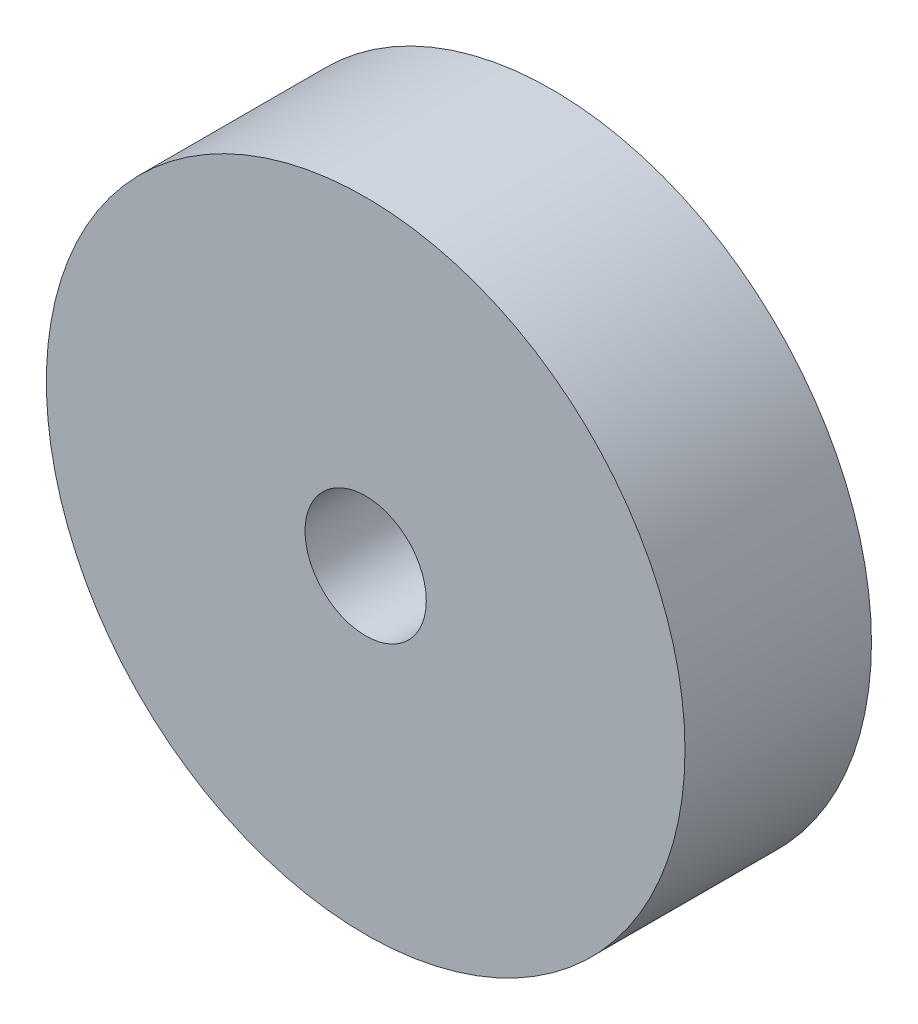
ISO-10303-21;
HEADER;
FILE_DESCRIPTION(('STEP AP214'),'2;1');
FILE_NAME('part.step','',(''),(''),'','','');
FILE_SCHEMA(('AUTOMOTIVE_DESIGN { 1 0 10303 214 1 1 1 1 }'));
ENDSEC;
DATA;
#1=APPLICATION_CONTEXT('core data for automotive mechanical design processes');
#2=APPLICATION_PROTOCOL_DEFINITION('international standard','automotive_design',2000,#1);
#3=PRODUCT_CONTEXT('',#1,'mechanical');
#4=PRODUCT('Part','Part','',(#3));
#5=PRODUCT_RELATED_PRODUCT_CATEGORY('part','',(#4));
#6=PRODUCT_DEFINITION_FORMATION('','',#4);
#7=PRODUCT_DEFINITION_CONTEXT('part definition',#1,'design');
#8=PRODUCT_DEFINITION('design','',#6,#7);
#9=PRODUCT_DEFINITION_SHAPE('','',#8);
#10=(LENGTH_UNIT() NAMED_UNIT(*) SI_UNIT(.MILLI.,.METRE.));
#11=(NAMED_UNIT(*) PLANE_ANGLE_UNIT() SI_UNIT($,.RADIAN.));
#12=(NAMED_UNIT(*) SI_UNIT($,.STERADIAN.) SOLID_ANGLE_UNIT());
#13=UNCERTAINTY_MEASURE_WITH_UNIT(LENGTH_MEASURE(1.E-05),#10,'distance_accuracy_value','');
#14=(GEOMETRIC_REPRESENTATION_CONTEXT(3) GLOBAL_UNCERTAINTY_ASSIGNED_CONTEXT((#13)) GLOBAL_UNIT_ASSIGNED_CONTEXT((#10,
#11,#12)) REPRESENTATION_CONTEXT('',''));
#15=CARTESIAN_POINT('',(0.,0.,0.));
#16=DIRECTION('',(0.,0.,1.));
#17=DIRECTION('',(1.,0.,0.));
#18=AXIS2_PLACEMENT_3D('',#15,#16,#17);
#19=CARTESIAN_POINT('',(0.,0.,40.));
#20=DIRECTION('',(0.,0.,1.));
#21=DIRECTION('',(1.,0.,0.));
#22=AXIS2_PLACEMENT_3D('',#19,#20,#21);
#23=PLANE('',#22);
#24=CARTESIAN_POINT('',(0.,0.,40.));
#25=DIRECTION('',(0.,0.,1.));
#26=DIRECTION('',(1.,0.,0.));
#27=AXIS2_PLACEMENT_3D('',#24,#25,#26);
#28=CIRCLE('',#27,68.5);
#29=CARTESIAN_POINT('',(68.5,0.,40.));
#30=VERTEX_POINT('',#29);
#31=EDGE_CURVE('E10',#30,#30,#28,.T.);
#32=ORIENTED_EDGE('',*,*,#31,.T.);
#33=EDGE_LOOP('',(#32));
#34=FACE_BOUND('',#33,.T.);
#35=CARTESIAN_POINT('',(0.,0.,40.));
#36=DIRECTION('',(0.,0.,1.));
#37=DIRECTION('',(1.,0.,0.));
#38=AXIS2_PLACEMENT_3D('',#35,#36,#37);
#39=CIRCLE('',#38,13.);
#40=CARTESIAN_POINT('',(13.,0.,40.));
#41=VERTEX_POINT('',#40);
#42=EDGE_CURVE('E42',#41,#41,#39,.T.);
#43=ORIENTED_EDGE('',*,*,#42,.F.);
#44=EDGE_LOOP('',(#43));
#45=FACE_BOUND('',#44,.T.);
#46=ADVANCED_FACE('F31',(#34,#45),#23,.T.);
#47=CARTESIAN_POINT('',(0.,0.,0.));
#48=DIRECTION('',(0.,0.,1.));
#49=DIRECTION('',(1.,0.,0.));
#50=AXIS2_PLACEMENT_3D('',#47,#48,#49);
#51=PLANE('',#50);
#52=CARTESIAN_POINT('',(0.,0.,0.));
#53=DIRECTION('',(0.,0.,1.));
#54=DIRECTION('',(1.,0.,0.));
#55=AXIS2_PLACEMENT_3D('',#52,#53,#54);
#56=CIRCLE('',#55,68.5);
#57=CARTESIAN_POINT('',(68.5,0.,0.));
#58=VERTEX_POINT('',#57);
#59=EDGE_CURVE('E35',#58,#58,#56,.T.);
#60=ORIENTED_EDGE('',*,*,#59,.F.);
#61=EDGE_LOOP('',(#60));
#62=FACE_BOUND('',#61,.T.);
#63=CARTESIAN_POINT('',(0.,0.,0.));
#64=DIRECTION('',(0.,0.,1.));
#65=DIRECTION('',(1.,0.,0.));
#66=AXIS2_PLACEMENT_3D('',#63,#64,#65);
#67=CIRCLE('',#66,13.);
#68=CARTESIAN_POINT('',(13.,0.,0.));
#69=VERTEX_POINT('',#68);
#70=EDGE_CURVE('E44',#69,#69,#67,.T.);
#71=ORIENTED_EDGE('',*,*,#70,.T.);
#72=EDGE_LOOP('',(#71));
#73=FACE_BOUND('',#72,.T.);
#74=ADVANCED_FACE('F54',(#62,#73),#51,.F.);
#75=CARTESIAN_POINT('',(0.,0.,40.));
#76=DIRECTION('',(0.,0.,-1.));
#77=DIRECTION('',(-1.,0.,0.));
#78=AXIS2_PLACEMENT_3D('',#75,#76,#77);
#79=CYLINDRICAL_SURFACE('',#78,68.5);
#80=ORIENTED_EDGE('',*,*,#31,.F.);
#81=EDGE_LOOP('',(#80));
#82=FACE_BOUND('',#81,.T.);
#83=ORIENTED_EDGE('',*,*,#59,.T.);
#84=EDGE_LOOP('',(#83));
#85=FACE_BOUND('',#84,.T.);
#86=ADVANCED_FACE('F33',(#82,#85),#79,.T.);
#87=CARTESIAN_POINT('',(0.,0.,40.));
#88=DIRECTION('',(0.,0.,-1.));
#89=DIRECTION('',(-1.,0.,0.));
#90=AXIS2_PLACEMENT_3D('',#87,#88,#89);
#91=CYLINDRICAL_SURFACE('',#90,13.);
#92=ORIENTED_EDGE('',*,*,#42,.T.);
#93=EDGE_LOOP('',(#92));
#94=FACE_BOUND('',#93,.T.);
#95=ORIENTED_EDGE('',*,*,#70,.F.);
#96=EDGE_LOOP('',(#95));
#97=FACE_BOUND('',#96,.T.);
#98=ADVANCED_FACE('F50',(#94,#97),#91,.F.);
#99=CLOSED_SHELL('',(#46,#74,#86,#98));
#100=MANIFOLD_SOLID_BREP('B2',#99);
#101=ADVANCED_BREP_SHAPE_REPRESENTATION('',(#18,#100),#14);
#102=SHAPE_DEFINITION_REPRESENTATION(#9,#101);
ENDSEC;
END-ISO-10303-21;
